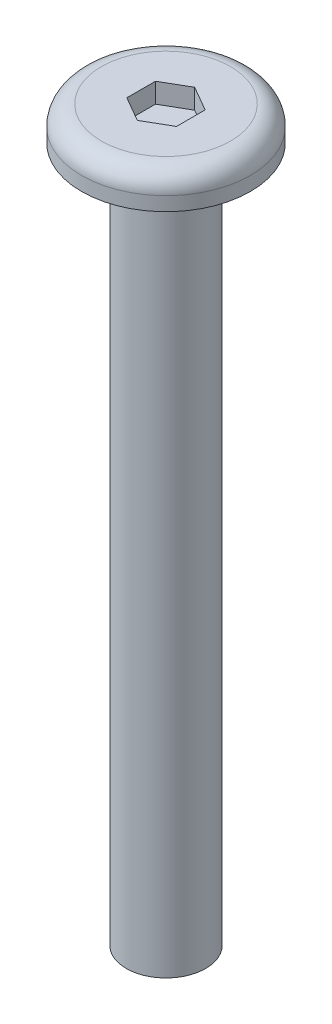
ISO-10303-21;
HEADER;
FILE_DESCRIPTION(('STEP AP214'),'2;1');
FILE_NAME('part.step','',(''),(''),'','','');
FILE_SCHEMA(('AUTOMOTIVE_DESIGN { 1 0 10303 214 1 1 1 1 }'));
ENDSEC;
DATA;
#1=APPLICATION_CONTEXT('core data for automotive mechanical design processes');
#2=APPLICATION_PROTOCOL_DEFINITION('international standard','automotive_design',2000,#1);
#3=PRODUCT_CONTEXT('',#1,'mechanical');
#4=PRODUCT('Part','Part','',(#3));
#5=PRODUCT_RELATED_PRODUCT_CATEGORY('part','',(#4));
#6=PRODUCT_DEFINITION_FORMATION('','',#4);
#7=PRODUCT_DEFINITION_CONTEXT('part definition',#1,'design');
#8=PRODUCT_DEFINITION('design','',#6,#7);
#9=PRODUCT_DEFINITION_SHAPE('','',#8);
#10=(LENGTH_UNIT() NAMED_UNIT(*) SI_UNIT(.MILLI.,.METRE.));
#11=(NAMED_UNIT(*) PLANE_ANGLE_UNIT() SI_UNIT($,.RADIAN.));
#12=(NAMED_UNIT(*) SI_UNIT($,.STERADIAN.) SOLID_ANGLE_UNIT());
#13=UNCERTAINTY_MEASURE_WITH_UNIT(LENGTH_MEASURE(1.E-05),#10,'distance_accuracy_value','');
#14=(GEOMETRIC_REPRESENTATION_CONTEXT(3) GLOBAL_UNCERTAINTY_ASSIGNED_CONTEXT((#13)) GLOBAL_UNIT_ASSIGNED_CONTEXT((#10,
#11,#12)) REPRESENTATION_CONTEXT('',''));
#15=CARTESIAN_POINT('',(0.,0.,0.));
#16=DIRECTION('',(0.,0.,1.));
#17=DIRECTION('',(1.,0.,0.));
#18=AXIS2_PLACEMENT_3D('',#15,#16,#17);
#19=CARTESIAN_POINT('',(0.,0.,0.));
#20=DIRECTION('',(0.,1.,0.));
#21=DIRECTION('',(0.,0.,1.));
#22=AXIS2_PLACEMENT_3D('',#19,#20,#21);
#23=PLANE('',#22);
#24=CARTESIAN_POINT('',(0.,0.,0.));
#25=DIRECTION('',(0.,1.,0.));
#26=DIRECTION('',(0.,0.,1.));
#27=AXIS2_PLACEMENT_3D('',#24,#25,#26);
#28=CIRCLE('',#27,2.);
#29=CARTESIAN_POINT('',(0.,0.,2.));
#30=VERTEX_POINT('',#29);
#31=EDGE_CURVE('E178',#30,#30,#28,.T.);
#32=ORIENTED_EDGE('',*,*,#31,.F.);
#33=EDGE_LOOP('',(#32));
#34=FACE_BOUND('',#33,.T.);
#35=CARTESIAN_POINT('',(0.,0.,0.));
#36=DIRECTION('',(0.,1.,0.));
#37=DIRECTION('',(0.,0.,1.));
#38=AXIS2_PLACEMENT_3D('',#35,#36,#37);
#39=CIRCLE('',#38,1.5);
#40=CARTESIAN_POINT('',(0.,0.,1.5));
#41=VERTEX_POINT('',#40);
#42=EDGE_CURVE('E174',#41,#41,#39,.T.);
#43=ORIENTED_EDGE('',*,*,#42,.T.);
#44=EDGE_LOOP('',(#43));
#45=FACE_BOUND('',#44,.T.);
#46=ADVANCED_FACE('F42',(#34,#45),#23,.F.);
#47=CARTESIAN_POINT('',(0.,35.,0.));
#48=DIRECTION('',(0.,-1.,0.));
#49=DIRECTION('',(0.,0.,-1.));
#50=AXIS2_PLACEMENT_3D('',#47,#48,#49);
#51=CYLINDRICAL_SURFACE('',#50,2.);
#52=CARTESIAN_POINT('',(0.,35.,0.));
#53=DIRECTION('',(0.,1.,0.));
#54=DIRECTION('',(0.,0.,1.));
#55=AXIS2_PLACEMENT_3D('',#52,#53,#54);
#56=CIRCLE('',#55,2.);
#57=CARTESIAN_POINT('',(0.,35.,2.));
#58=VERTEX_POINT('',#57);
#59=EDGE_CURVE('E179',#58,#58,#56,.T.);
#60=ORIENTED_EDGE('',*,*,#59,.F.);
#61=EDGE_LOOP('',(#60));
#62=FACE_BOUND('',#61,.T.);
#63=ORIENTED_EDGE('',*,*,#31,.T.);
#64=EDGE_LOOP('',(#63));
#65=FACE_BOUND('',#64,.T.);
#66=ADVANCED_FACE('F201',(#62,#65),#51,.T.);
#67=CARTESIAN_POINT('',(0.,35.,0.));
#68=DIRECTION('',(0.,-1.,0.));
#69=DIRECTION('',(0.,0.,-1.));
#70=AXIS2_PLACEMENT_3D('',#67,#68,#69);
#71=CYLINDRICAL_SURFACE('',#70,1.5);
#72=CARTESIAN_POINT('',(0.,35.,0.));
#73=DIRECTION('',(0.,1.,0.));
#74=DIRECTION('',(0.,0.,1.));
#75=AXIS2_PLACEMENT_3D('',#72,#73,#74);
#76=CIRCLE('',#75,1.5);
#77=CARTESIAN_POINT('',(0.,35.,1.5));
#78=VERTEX_POINT('',#77);
#79=EDGE_CURVE('E170',#78,#78,#76,.T.);
#80=ORIENTED_EDGE('',*,*,#79,.T.);
#81=EDGE_LOOP('',(#80));
#82=FACE_BOUND('',#81,.T.);
#83=ORIENTED_EDGE('',*,*,#42,.F.);
#84=EDGE_LOOP('',(#83));
#85=FACE_BOUND('',#84,.T.);
#86=ADVANCED_FACE('F207',(#82,#85),#71,.F.);
#87=CARTESIAN_POINT('',(0.,35.,0.));
#88=DIRECTION('',(0.,1.,0.));
#89=DIRECTION('',(0.,0.,1.));
#90=AXIS2_PLACEMENT_3D('',#87,#88,#89);
#91=PLANE('',#90);
#92=ORIENTED_EDGE('',*,*,#79,.F.);
#93=EDGE_LOOP('',(#92));
#94=FACE_BOUND('',#93,.T.);
#95=ADVANCED_FACE('F214',(#94),#91,.F.);
#96=CARTESIAN_POINT('',(0.,36.7,0.));
#97=DIRECTION('',(0.,-1.,0.));
#98=DIRECTION('',(0.,0.,-1.));
#99=AXIS2_PLACEMENT_3D('',#96,#97,#98);
#100=CYLINDRICAL_SURFACE('',#99,4.25);
#101=CARTESIAN_POINT('',(0.,35.7,0.));
#102=DIRECTION('',(0.,1.,0.));
#103=DIRECTION('',(0.,0.,1.));
#104=AXIS2_PLACEMENT_3D('',#101,#102,#103);
#105=CIRCLE('',#104,4.25);
#106=CARTESIAN_POINT('',(0.,35.7,4.25));
#107=VERTEX_POINT('',#106);
#108=EDGE_CURVE('E11',#107,#107,#105,.F.);
#109=ORIENTED_EDGE('',*,*,#108,.T.);
#110=EDGE_LOOP('',(#109));
#111=FACE_BOUND('',#110,.T.);
#112=CARTESIAN_POINT('',(0.,35.,0.));
#113=DIRECTION('',(0.,1.,0.));
#114=DIRECTION('',(0.,0.,1.));
#115=AXIS2_PLACEMENT_3D('',#112,#113,#114);
#116=CIRCLE('',#115,4.25);
#117=CARTESIAN_POINT('',(0.,35.,4.25));
#118=VERTEX_POINT('',#117);
#119=EDGE_CURVE('E157',#118,#118,#116,.T.);
#120=ORIENTED_EDGE('',*,*,#119,.T.);
#121=EDGE_LOOP('',(#120));
#122=FACE_BOUND('',#121,.T.);
#123=ADVANCED_FACE('F216',(#111,#122),#100,.T.);
#124=CARTESIAN_POINT('',(0.,36.7,0.));
#125=DIRECTION('',(0.,1.,0.));
#126=DIRECTION('',(0.,0.,1.));
#127=AXIS2_PLACEMENT_3D('',#124,#125,#126);
#128=PLANE('',#127);
#129=CARTESIAN_POINT('',(0.,36.7,0.));
#130=DIRECTION('',(0.,1.,0.));
#131=DIRECTION('',(0.,0.,1.));
#132=AXIS2_PLACEMENT_3D('',#129,#130,#131);
#133=CIRCLE('',#132,3.25);
#134=CARTESIAN_POINT('',(0.,36.7,3.25));
#135=VERTEX_POINT('',#134);
#136=EDGE_CURVE('E51',#135,#135,#133,.T.);
#137=ORIENTED_EDGE('',*,*,#136,.T.);
#138=EDGE_LOOP('',(#137));
#139=FACE_BOUND('',#138,.T.);
#140=DIRECTION('',(0.,0.,-1.));
#141=VECTOR('',#140,1.);
#142=CARTESIAN_POINT('',(1.25,36.7,0.721687836487033));
#143=LINE('',#142,#141);
#144=CARTESIAN_POINT('',(1.25,36.7,0.721687836487033));
#145=VERTEX_POINT('',#144);
#146=CARTESIAN_POINT('',(1.25,36.7,-0.721687836487032));
#147=VERTEX_POINT('',#146);
#148=EDGE_CURVE('E58',#145,#147,#143,.T.);
#149=ORIENTED_EDGE('',*,*,#148,.F.);
#150=DIRECTION('',(0.866025403784439,0.,-0.5));
#151=VECTOR('',#150,1.);
#152=CARTESIAN_POINT('',(0.,36.7,1.44337567297407));
#153=LINE('',#152,#151);
#154=CARTESIAN_POINT('',(0.,36.7,1.44337567297407));
#155=VERTEX_POINT('',#154);
#156=EDGE_CURVE('E151',#155,#145,#153,.T.);
#157=ORIENTED_EDGE('',*,*,#156,.F.);
#158=DIRECTION('',(0.866025403784439,0.,0.5));
#159=VECTOR('',#158,1.);
#160=CARTESIAN_POINT('',(-1.25,36.7,0.721687836487033));
#161=LINE('',#160,#159);
#162=CARTESIAN_POINT('',(-1.25,36.7,0.721687836487033));
#163=VERTEX_POINT('',#162);
#164=EDGE_CURVE('E148',#163,#155,#161,.T.);
#165=ORIENTED_EDGE('',*,*,#164,.F.);
#166=DIRECTION('',(0.,0.,1.));
#167=VECTOR('',#166,1.);
#168=CARTESIAN_POINT('',(-1.25,36.7,-0.721687836487032));
#169=LINE('',#168,#167);
#170=CARTESIAN_POINT('',(-1.25,36.7,-0.721687836487032));
#171=VERTEX_POINT('',#170);
#172=EDGE_CURVE('E106',#171,#163,#169,.T.);
#173=ORIENTED_EDGE('',*,*,#172,.F.);
#174=DIRECTION('',(-0.866025403784438,0.,0.5));
#175=VECTOR('',#174,1.);
#176=CARTESIAN_POINT('',(0.,36.7,-1.44337567297406));
#177=LINE('',#176,#175);
#178=CARTESIAN_POINT('',(0.,36.7,-1.44337567297406));
#179=VERTEX_POINT('',#178);
#180=EDGE_CURVE('E142',#179,#171,#177,.T.);
#181=ORIENTED_EDGE('',*,*,#180,.F.);
#182=DIRECTION('',(-0.866025403784438,0.,-0.5));
#183=VECTOR('',#182,1.);
#184=CARTESIAN_POINT('',(1.25,36.7,-0.721687836487032));
#185=LINE('',#184,#183);
#186=EDGE_CURVE('E138',#147,#179,#185,.T.);
#187=ORIENTED_EDGE('',*,*,#186,.F.);
#188=EDGE_LOOP('',(#149,#157,#165,#173,#181,#187));
#189=FACE_BOUND('',#188,.T.);
#190=ADVANCED_FACE('F189',(#139,#189),#128,.T.);
#191=ORIENTED_EDGE('',*,*,#59,.T.);
#192=EDGE_LOOP('',(#191));
#193=FACE_BOUND('',#192,.T.);
#194=ORIENTED_EDGE('',*,*,#119,.F.);
#195=EDGE_LOOP('',(#194));
#196=FACE_BOUND('',#195,.T.);
#197=ADVANCED_FACE('F220',(#193,#196),#91,.F.);
#198=CARTESIAN_POINT('',(1.25,35.7,0.721687836487033));
#199=DIRECTION('',(1.,0.,0.));
#200=DIRECTION('',(0.,0.,-1.));
#201=AXIS2_PLACEMENT_3D('',#198,#199,#200);
#202=PLANE('',#201);
#203=ORIENTED_EDGE('',*,*,#148,.T.);
#204=DIRECTION('',(0.,1.,0.));
#205=VECTOR('',#204,1.);
#206=CARTESIAN_POINT('',(1.25,35.7,-0.721687836487032));
#207=LINE('',#206,#205);
#208=CARTESIAN_POINT('',(1.25,35.7,-0.721687836487032));
#209=VERTEX_POINT('',#208);
#210=EDGE_CURVE('E88',#209,#147,#207,.T.);
#211=ORIENTED_EDGE('',*,*,#210,.F.);
#212=DIRECTION('',(0.,0.,-1.));
#213=VECTOR('',#212,1.);
#214=CARTESIAN_POINT('',(1.25,35.7,0.721687836487033));
#215=LINE('',#214,#213);
#216=CARTESIAN_POINT('',(1.25,35.7,0.721687836487033));
#217=VERTEX_POINT('',#216);
#218=EDGE_CURVE('E154',#217,#209,#215,.T.);
#219=ORIENTED_EDGE('',*,*,#218,.F.);
#220=DIRECTION('',(0.,1.,0.));
#221=VECTOR('',#220,1.);
#222=CARTESIAN_POINT('',(1.25,35.7,0.721687836487033));
#223=LINE('',#222,#221);
#224=EDGE_CURVE('E66',#217,#145,#223,.T.);
#225=ORIENTED_EDGE('',*,*,#224,.T.);
#226=EDGE_LOOP('',(#203,#211,#219,#225));
#227=FACE_BOUND('',#226,.T.);
#228=ADVANCED_FACE('F223',(#227),#202,.F.);
#229=CARTESIAN_POINT('',(0.,35.7,1.44337567297407));
#230=DIRECTION('',(0.5,0.,0.866025403784439));
#231=DIRECTION('',(0.866025403784439,0.,-0.5));
#232=AXIS2_PLACEMENT_3D('',#229,#230,#231);
#233=PLANE('',#232);
#234=ORIENTED_EDGE('',*,*,#156,.T.);
#235=ORIENTED_EDGE('',*,*,#224,.F.);
#236=DIRECTION('',(0.866025403784439,0.,-0.5));
#237=VECTOR('',#236,1.);
#238=CARTESIAN_POINT('',(0.,35.7,1.44337567297407));
#239=LINE('',#238,#237);
#240=CARTESIAN_POINT('',(0.,35.7,1.44337567297407));
#241=VERTEX_POINT('',#240);
#242=EDGE_CURVE('E120',#241,#217,#239,.T.);
#243=ORIENTED_EDGE('',*,*,#242,.F.);
#244=DIRECTION('',(0.,1.,0.));
#245=VECTOR('',#244,1.);
#246=CARTESIAN_POINT('',(0.,35.7,1.44337567297407));
#247=LINE('',#246,#245);
#248=EDGE_CURVE('E111',#241,#155,#247,.T.);
#249=ORIENTED_EDGE('',*,*,#248,.T.);
#250=EDGE_LOOP('',(#234,#235,#243,#249));
#251=FACE_BOUND('',#250,.T.);
#252=ADVANCED_FACE('F229',(#251),#233,.F.);
#253=CARTESIAN_POINT('',(-1.25,35.7,0.721687836487033));
#254=DIRECTION('',(-0.5,0.,0.866025403784439));
#255=DIRECTION('',(0.866025403784439,0.,0.5));
#256=AXIS2_PLACEMENT_3D('',#253,#254,#255);
#257=PLANE('',#256);
#258=ORIENTED_EDGE('',*,*,#164,.T.);
#259=ORIENTED_EDGE('',*,*,#248,.F.);
#260=DIRECTION('',(0.866025403784439,0.,0.5));
#261=VECTOR('',#260,1.);
#262=CARTESIAN_POINT('',(-1.25,35.7,0.721687836487033));
#263=LINE('',#262,#261);
#264=CARTESIAN_POINT('',(-1.25,35.7,0.721687836487033));
#265=VERTEX_POINT('',#264);
#266=EDGE_CURVE('E115',#265,#241,#263,.T.);
#267=ORIENTED_EDGE('',*,*,#266,.F.);
#268=DIRECTION('',(0.,1.,0.));
#269=VECTOR('',#268,1.);
#270=CARTESIAN_POINT('',(-1.25,35.7,0.721687836487033));
#271=LINE('',#270,#269);
#272=EDGE_CURVE('E99',#265,#163,#271,.T.);
#273=ORIENTED_EDGE('',*,*,#272,.T.);
#274=EDGE_LOOP('',(#258,#259,#267,#273));
#275=FACE_BOUND('',#274,.T.);
#276=ADVANCED_FACE('F116',(#275),#257,.F.);
#277=CARTESIAN_POINT('',(-1.25,35.7,-0.721687836487032));
#278=DIRECTION('',(-1.,0.,0.));
#279=DIRECTION('',(0.,0.,1.));
#280=AXIS2_PLACEMENT_3D('',#277,#278,#279);
#281=PLANE('',#280);
#282=ORIENTED_EDGE('',*,*,#172,.T.);
#283=ORIENTED_EDGE('',*,*,#272,.F.);
#284=DIRECTION('',(0.,0.,1.));
#285=VECTOR('',#284,1.);
#286=CARTESIAN_POINT('',(-1.25,35.7,-0.721687836487032));
#287=LINE('',#286,#285);
#288=CARTESIAN_POINT('',(-1.25,35.7,-0.721687836487032));
#289=VERTEX_POINT('',#288);
#290=EDGE_CURVE('E103',#289,#265,#287,.T.);
#291=ORIENTED_EDGE('',*,*,#290,.F.);
#292=DIRECTION('',(0.,1.,0.));
#293=VECTOR('',#292,1.);
#294=CARTESIAN_POINT('',(-1.25,35.7,-0.721687836487032));
#295=LINE('',#294,#293);
#296=EDGE_CURVE('E112',#289,#171,#295,.T.);
#297=ORIENTED_EDGE('',*,*,#296,.T.);
#298=EDGE_LOOP('',(#282,#283,#291,#297));
#299=FACE_BOUND('',#298,.T.);
#300=ADVANCED_FACE('F101',(#299),#281,.F.);
#301=CARTESIAN_POINT('',(0.,35.7,-1.44337567297406));
#302=DIRECTION('',(-0.5,0.,-0.866025403784439));
#303=DIRECTION('',(-0.866025403784439,0.,0.5));
#304=AXIS2_PLACEMENT_3D('',#301,#302,#303);
#305=PLANE('',#304);
#306=ORIENTED_EDGE('',*,*,#180,.T.);
#307=ORIENTED_EDGE('',*,*,#296,.F.);
#308=DIRECTION('',(-0.866025403784438,0.,0.5));
#309=VECTOR('',#308,1.);
#310=CARTESIAN_POINT('',(0.,35.7,-1.44337567297406));
#311=LINE('',#310,#309);
#312=CARTESIAN_POINT('',(0.,35.7,-1.44337567297406));
#313=VERTEX_POINT('',#312);
#314=EDGE_CURVE('E126',#313,#289,#311,.T.);
#315=ORIENTED_EDGE('',*,*,#314,.F.);
#316=DIRECTION('',(0.,1.,0.));
#317=VECTOR('',#316,1.);
#318=CARTESIAN_POINT('',(0.,35.7,-1.44337567297406));
#319=LINE('',#318,#317);
#320=EDGE_CURVE('E162',#313,#179,#319,.T.);
#321=ORIENTED_EDGE('',*,*,#320,.T.);
#322=EDGE_LOOP('',(#306,#307,#315,#321));
#323=FACE_BOUND('',#322,.T.);
#324=ADVANCED_FACE('F232',(#323),#305,.F.);
#325=CARTESIAN_POINT('',(1.25,35.7,-0.721687836487032));
#326=DIRECTION('',(0.5,0.,-0.866025403784438));
#327=DIRECTION('',(-0.866025403784438,0.,-0.5));
#328=AXIS2_PLACEMENT_3D('',#325,#326,#327);
#329=PLANE('',#328);
#330=ORIENTED_EDGE('',*,*,#186,.T.);
#331=ORIENTED_EDGE('',*,*,#320,.F.);
#332=DIRECTION('',(-0.866025403784438,0.,-0.5));
#333=VECTOR('',#332,1.);
#334=CARTESIAN_POINT('',(1.25,35.7,-0.721687836487032));
#335=LINE('',#334,#333);
#336=EDGE_CURVE('E130',#209,#313,#335,.T.);
#337=ORIENTED_EDGE('',*,*,#336,.F.);
#338=ORIENTED_EDGE('',*,*,#210,.T.);
#339=EDGE_LOOP('',(#330,#331,#337,#338));
#340=FACE_BOUND('',#339,.T.);
#341=ADVANCED_FACE('F197',(#340),#329,.F.);
#342=CARTESIAN_POINT('',(0.,35.7,0.));
#343=DIRECTION('',(0.,1.,0.));
#344=DIRECTION('',(0.,0.,1.));
#345=AXIS2_PLACEMENT_3D('',#342,#343,#344);
#346=PLANE('',#345);
#347=ORIENTED_EDGE('',*,*,#218,.T.);
#348=ORIENTED_EDGE('',*,*,#336,.T.);
#349=ORIENTED_EDGE('',*,*,#314,.T.);
#350=ORIENTED_EDGE('',*,*,#290,.T.);
#351=ORIENTED_EDGE('',*,*,#266,.T.);
#352=ORIENTED_EDGE('',*,*,#242,.T.);
#353=EDGE_LOOP('',(#347,#348,#349,#350,#351,#352));
#354=FACE_BOUND('',#353,.T.);
#355=ADVANCED_FACE('F123',(#354),#346,.T.);
#356=CARTESIAN_POINT('',(0.,35.7,0.));
#357=DIRECTION('',(0.,1.,0.));
#358=DIRECTION('',(0.,0.,1.));
#359=AXIS2_PLACEMENT_3D('',#356,#357,#358);
#360=TOROIDAL_SURFACE('',#359,3.25,1.);
#361=ORIENTED_EDGE('',*,*,#108,.F.);
#362=EDGE_LOOP('',(#361));
#363=FACE_BOUND('',#362,.T.);
#364=ORIENTED_EDGE('',*,*,#136,.F.);
#365=EDGE_LOOP('',(#364));
#366=FACE_BOUND('',#365,.T.);
#367=ADVANCED_FACE('F44',(#363,#366),#360,.T.);
#368=CLOSED_SHELL('',(#46,#66,#86,#95,#123,#190,#197,#228,#252,#276,#300,#324,#341,#355,#367));
#369=MANIFOLD_SOLID_BREP('B2',#368);
#370=ADVANCED_BREP_SHAPE_REPRESENTATION('',(#18,#369),#14);
#371=SHAPE_DEFINITION_REPRESENTATION(#9,#370);
ENDSEC;
END-ISO-10303-21;
